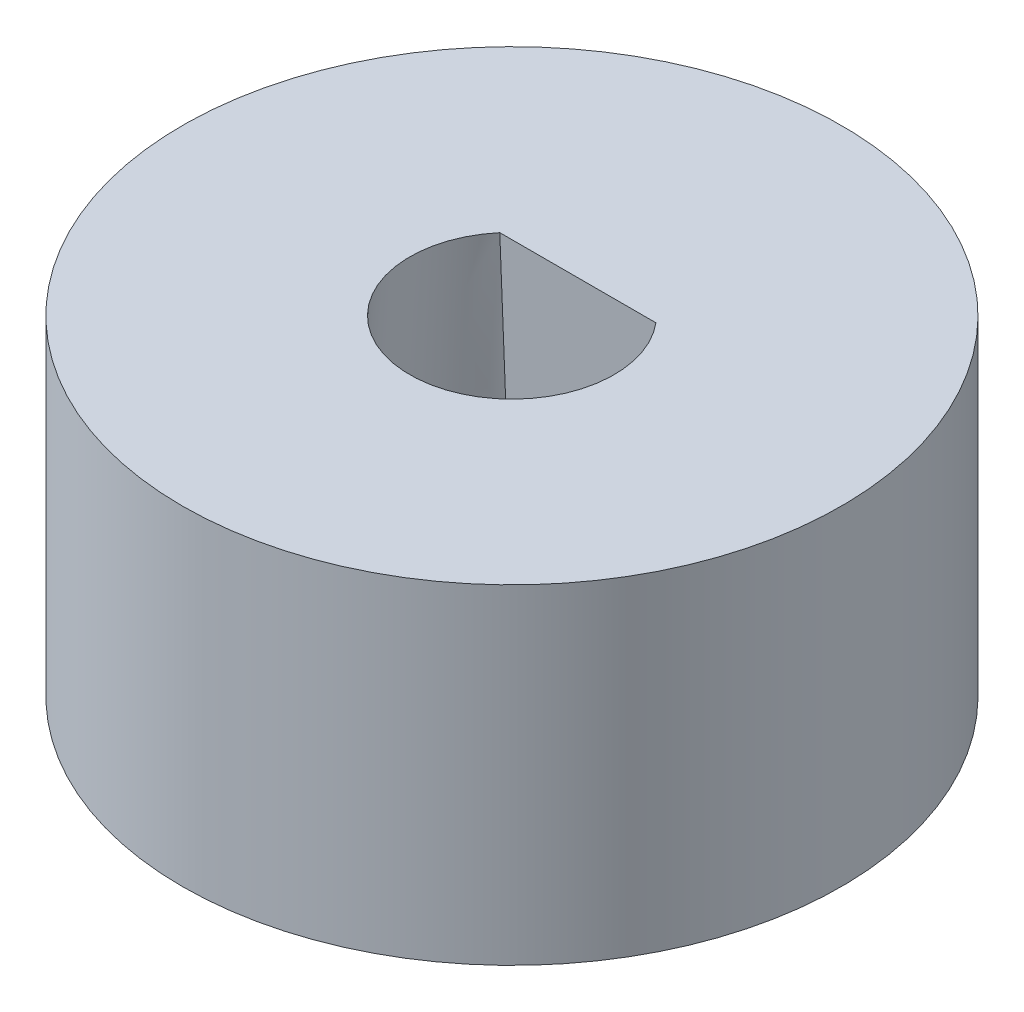
ISO-10303-21;
HEADER;
FILE_DESCRIPTION(('STEP AP214'),'2;1');
FILE_NAME('part.step','',(''),(''),'','','');
FILE_SCHEMA(('AUTOMOTIVE_DESIGN { 1 0 10303 214 1 1 1 1 }'));
ENDSEC;
DATA;
#1=APPLICATION_CONTEXT('core data for automotive mechanical design processes');
#2=APPLICATION_PROTOCOL_DEFINITION('international standard','automotive_design',2000,#1);
#3=PRODUCT_CONTEXT('',#1,'mechanical');
#4=PRODUCT('Part','Part','',(#3));
#5=PRODUCT_RELATED_PRODUCT_CATEGORY('part','',(#4));
#6=PRODUCT_DEFINITION_FORMATION('','',#4);
#7=PRODUCT_DEFINITION_CONTEXT('part definition',#1,'design');
#8=PRODUCT_DEFINITION('design','',#6,#7);
#9=PRODUCT_DEFINITION_SHAPE('','',#8);
#10=(LENGTH_UNIT() NAMED_UNIT(*) SI_UNIT(.MILLI.,.METRE.));
#11=(NAMED_UNIT(*) PLANE_ANGLE_UNIT() SI_UNIT($,.RADIAN.));
#12=(NAMED_UNIT(*) SI_UNIT($,.STERADIAN.) SOLID_ANGLE_UNIT());
#13=UNCERTAINTY_MEASURE_WITH_UNIT(LENGTH_MEASURE(1.E-05),#10,'distance_accuracy_value','');
#14=(GEOMETRIC_REPRESENTATION_CONTEXT(3) GLOBAL_UNCERTAINTY_ASSIGNED_CONTEXT((#13)) GLOBAL_UNIT_ASSIGNED_CONTEXT((#10,
#11,#12)) REPRESENTATION_CONTEXT('',''));
#15=CARTESIAN_POINT('',(0.,0.,0.));
#16=DIRECTION('',(0.,0.,1.));
#17=DIRECTION('',(1.,0.,0.));
#18=AXIS2_PLACEMENT_3D('',#15,#16,#17);
#19=CARTESIAN_POINT('',(0.,5.,-1.));
#20=DIRECTION('',(0.,-0.0697564737441255,0.997564050259824));
#21=DIRECTION('',(0.,-0.997564050259824,-0.0697564737441255));
#22=AXIS2_PLACEMENT_3D('',#19,#20,#21);
#23=PLANE('',#22);
#24=DIRECTION('',(-1.,0.,0.));
#25=VECTOR('',#24,1.);
#26=CARTESIAN_POINT('',(0.,0.,-1.34963405971755));
#27=LINE('',#26,#25);
#28=CARTESIAN_POINT('',(-1.33682364793914,0.,-1.34963405971755));
#29=VERTEX_POINT('',#28);
#30=CARTESIAN_POINT('',(1.33682364793914,0.,-1.34963405971755));
#31=VERTEX_POINT('',#30);
#32=EDGE_CURVE('E50',#29,#31,#27,.F.);
#33=ORIENTED_EDGE('',*,*,#32,.T.);
#34=CARTESIAN_POINT('',(1.1842719282327,5.,-0.999999999999999));
#35=CARTESIAN_POINT('',(1.199908390513,4.51845239119432,-1.0336730890828));
#36=CARTESIAN_POINT('',(1.21523945436054,4.03689498006114,-1.06734686361112));
#37=CARTESIAN_POINT('',(1.24534856338564,3.07376340557722,-1.13469558409691));
#38=CARTESIAN_POINT('',(1.26012660909432,2.59218924224303,-1.16837053005323));
#39=CARTESIAN_POINT('',(1.28527048100784,1.75884729659497,-1.2266434755712));
#40=CARTESIAN_POINT('',(1.29575180911673,1.40708297198579,-1.25124123334659));
#41=CARTESIAN_POINT('',(1.31646807301364,0.703546854100387,-1.30043727115743));
#42=CARTESIAN_POINT('',(1.32670300862905,0.351775060819104,-1.32503555119324));
#43=CARTESIAN_POINT('',(1.33682364793918,0.,-1.34963405971755));
#44=B_SPLINE_CURVE_WITH_KNOTS('',3,(#34,#35,#36,#37,#38,#39,#40,#41,#42,#43),.UNSPECIFIED.,.F.,
.F.,(4,2,2,2,4),(0.,1.4489298577984,2.89785832396852,3.95619535122323,5.01453311992298),.UNSPECIFIED.);
#45=CARTESIAN_POINT('',(1.1842719282327,5.,-0.999999999999999));
#46=VERTEX_POINT('',#45);
#47=EDGE_CURVE('E11',#46,#31,#44,.T.);
#48=ORIENTED_EDGE('',*,*,#47,.F.);
#49=DIRECTION('',(1.,0.,0.));
#50=VECTOR('',#49,1.);
#51=CARTESIAN_POINT('',(0.,5.,-1.));
#52=LINE('',#51,#50);
#53=CARTESIAN_POINT('',(-1.1842719282327,5.,-0.999999999999999));
#54=VERTEX_POINT('',#53);
#55=EDGE_CURVE('E74',#54,#46,#52,.T.);
#56=ORIENTED_EDGE('',*,*,#55,.F.);
#57=CARTESIAN_POINT('',(-1.1842719282327,5.,-0.999999999999999));
#58=CARTESIAN_POINT('',(-1.199908390513,4.51845239119432,-1.0336730890828));
#59=CARTESIAN_POINT('',(-1.21523945436054,4.03689498006114,-1.06734686361112));
#60=CARTESIAN_POINT('',(-1.24534856338564,3.07376340557722,-1.13469558409691));
#61=CARTESIAN_POINT('',(-1.26012660909432,2.59218924224303,-1.16837053005323));
#62=CARTESIAN_POINT('',(-1.28527048100784,1.75884729659497,-1.2266434755712));
#63=CARTESIAN_POINT('',(-1.29575180911673,1.40708297198579,-1.25124123334659));
#64=CARTESIAN_POINT('',(-1.31646807301364,0.703546854100387,-1.30043727115743));
#65=CARTESIAN_POINT('',(-1.32670300862905,0.351775060819104,-1.32503555119324));
#66=CARTESIAN_POINT('',(-1.33682364793917,0.,-1.34963405971755));
#67=B_SPLINE_CURVE_WITH_KNOTS('',3,(#57,#58,#59,#60,#61,#62,#63,#64,#65,#66),.UNSPECIFIED.,.F.,
.F.,(4,2,2,2,4),(0.,1.4489298577984,2.89785832396852,3.95619535122323,5.01453311992298),.UNSPECIFIED.);
#68=EDGE_CURVE('E56',#54,#29,#67,.T.);
#69=ORIENTED_EDGE('',*,*,#68,.T.);
#70=EDGE_LOOP('',(#33,#48,#56,#69));
#71=FACE_BOUND('',#70,.T.);
#72=ADVANCED_FACE('F45',(#71),#23,.T.);
#73=CARTESIAN_POINT('',(0.,5.,0.));
#74=DIRECTION('',(0.,-1.,0.));
#75=DIRECTION('',(0.,0.,1.));
#76=AXIS2_PLACEMENT_3D('',#73,#74,#75);
#77=CONICAL_SURFACE('',#76,1.55,0.0698131700797733);
#78=CARTESIAN_POINT('',(0.,0.,0.));
#79=DIRECTION('',(0.,1.,0.));
#80=DIRECTION('',(0.,0.,1.));
#81=AXIS2_PLACEMENT_3D('',#78,#79,#80);
#82=CIRCLE('',#81,1.89963405971755);
#83=EDGE_CURVE('E81',#29,#31,#82,.T.);
#84=ORIENTED_EDGE('',*,*,#83,.F.);
#85=ORIENTED_EDGE('',*,*,#68,.F.);
#86=CARTESIAN_POINT('',(0.,5.,0.));
#87=DIRECTION('',(0.,1.,0.));
#88=DIRECTION('',(0.,0.,1.));
#89=AXIS2_PLACEMENT_3D('',#86,#87,#88);
#90=CIRCLE('',#89,1.55);
#91=EDGE_CURVE('E111',#54,#46,#90,.T.);
#92=ORIENTED_EDGE('',*,*,#91,.T.);
#93=ORIENTED_EDGE('',*,*,#47,.T.);
#94=EDGE_LOOP('',(#84,#85,#92,#93));
#95=FACE_BOUND('',#94,.T.);
#96=ADVANCED_FACE('F47',(#95),#77,.F.);
#97=CARTESIAN_POINT('',(0.,5.,0.));
#98=DIRECTION('',(0.,-1.,0.));
#99=DIRECTION('',(0.,0.,-1.));
#100=AXIS2_PLACEMENT_3D('',#97,#98,#99);
#101=CYLINDRICAL_SURFACE('',#100,5.);
#102=CARTESIAN_POINT('',(0.,5.,0.));
#103=DIRECTION('',(0.,1.,0.));
#104=DIRECTION('',(0.,0.,1.));
#105=AXIS2_PLACEMENT_3D('',#102,#103,#104);
#106=CIRCLE('',#105,5.);
#107=CARTESIAN_POINT('',(0.,5.,5.));
#108=VERTEX_POINT('',#107);
#109=EDGE_CURVE('E76',#108,#108,#106,.T.);
#110=ORIENTED_EDGE('',*,*,#109,.F.);
#111=EDGE_LOOP('',(#110));
#112=FACE_BOUND('',#111,.T.);
#113=CARTESIAN_POINT('',(0.,0.,0.));
#114=DIRECTION('',(0.,1.,0.));
#115=DIRECTION('',(0.,0.,1.));
#116=AXIS2_PLACEMENT_3D('',#113,#114,#115);
#117=CIRCLE('',#116,5.);
#118=CARTESIAN_POINT('',(0.,0.,5.));
#119=VERTEX_POINT('',#118);
#120=EDGE_CURVE('E82',#119,#119,#117,.T.);
#121=ORIENTED_EDGE('',*,*,#120,.T.);
#122=EDGE_LOOP('',(#121));
#123=FACE_BOUND('',#122,.T.);
#124=ADVANCED_FACE('F96',(#112,#123),#101,.T.);
#125=CARTESIAN_POINT('',(0.,5.,0.));
#126=DIRECTION('',(0.,1.,0.));
#127=DIRECTION('',(0.,0.,1.));
#128=AXIS2_PLACEMENT_3D('',#125,#126,#127);
#129=PLANE('',#128);
#130=ORIENTED_EDGE('',*,*,#55,.T.);
#131=ORIENTED_EDGE('',*,*,#91,.F.);
#132=EDGE_LOOP('',(#130,#131));
#133=FACE_BOUND('',#132,.T.);
#134=ORIENTED_EDGE('',*,*,#109,.T.);
#135=EDGE_LOOP('',(#134));
#136=FACE_BOUND('',#135,.T.);
#137=ADVANCED_FACE('F100',(#133,#136),#129,.T.);
#138=CARTESIAN_POINT('',(0.,0.,0.));
#139=DIRECTION('',(0.,1.,0.));
#140=DIRECTION('',(0.,0.,1.));
#141=AXIS2_PLACEMENT_3D('',#138,#139,#140);
#142=PLANE('',#141);
#143=ORIENTED_EDGE('',*,*,#32,.F.);
#144=ORIENTED_EDGE('',*,*,#83,.T.);
#145=EDGE_LOOP('',(#143,#144));
#146=FACE_BOUND('',#145,.T.);
#147=ORIENTED_EDGE('',*,*,#120,.F.);
#148=EDGE_LOOP('',(#147));
#149=FACE_BOUND('',#148,.T.);
#150=ADVANCED_FACE('F79',(#146,#149),#142,.F.);
#151=CLOSED_SHELL('',(#72,#96,#124,#137,#150));
#152=MANIFOLD_SOLID_BREP('B2',#151);
#153=ADVANCED_BREP_SHAPE_REPRESENTATION('',(#18,#152),#14);
#154=SHAPE_DEFINITION_REPRESENTATION(#9,#153);
ENDSEC;
END-ISO-10303-21;
